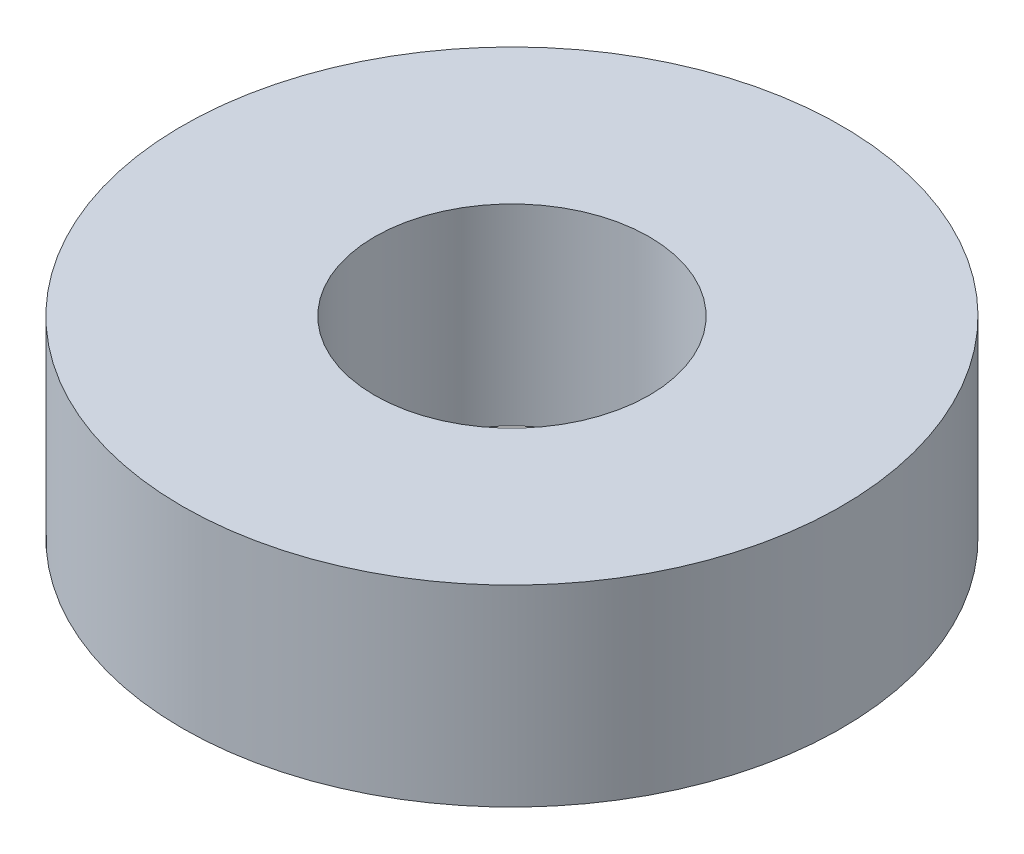
ISO-10303-21;
HEADER;
FILE_DESCRIPTION(('STEP AP214'),'2;1');
FILE_NAME('part.step','',(''),(''),'','','');
FILE_SCHEMA(('AUTOMOTIVE_DESIGN { 1 0 10303 214 1 1 1 1 }'));
ENDSEC;
DATA;
#1=APPLICATION_CONTEXT('core data for automotive mechanical design processes');
#2=APPLICATION_PROTOCOL_DEFINITION('international standard','automotive_design',2000,#1);
#3=PRODUCT_CONTEXT('',#1,'mechanical');
#4=PRODUCT('Part','Part','',(#3));
#5=PRODUCT_RELATED_PRODUCT_CATEGORY('part','',(#4));
#6=PRODUCT_DEFINITION_FORMATION('','',#4);
#7=PRODUCT_DEFINITION_CONTEXT('part definition',#1,'design');
#8=PRODUCT_DEFINITION('design','',#6,#7);
#9=PRODUCT_DEFINITION_SHAPE('','',#8);
#10=(LENGTH_UNIT() NAMED_UNIT(*) SI_UNIT(.MILLI.,.METRE.));
#11=(NAMED_UNIT(*) PLANE_ANGLE_UNIT() SI_UNIT($,.RADIAN.));
#12=(NAMED_UNIT(*) SI_UNIT($,.STERADIAN.) SOLID_ANGLE_UNIT());
#13=UNCERTAINTY_MEASURE_WITH_UNIT(LENGTH_MEASURE(1.E-05),#10,'distance_accuracy_value','');
#14=(GEOMETRIC_REPRESENTATION_CONTEXT(3) GLOBAL_UNCERTAINTY_ASSIGNED_CONTEXT((#13)) GLOBAL_UNIT_ASSIGNED_CONTEXT((#10,
#11,#12)) REPRESENTATION_CONTEXT('',''));
#15=CARTESIAN_POINT('',(0.,0.,0.));
#16=DIRECTION('',(0.,0.,1.));
#17=DIRECTION('',(1.,0.,0.));
#18=AXIS2_PLACEMENT_3D('',#15,#16,#17);
#19=CARTESIAN_POINT('',(0.,7.,0.));
#20=DIRECTION('',(0.,1.,0.));
#21=DIRECTION('',(0.,0.,1.));
#22=AXIS2_PLACEMENT_3D('',#19,#20,#21);
#23=PLANE('',#22);
#24=CARTESIAN_POINT('',(0.,7.,0.));
#25=DIRECTION('',(0.,1.,0.));
#26=DIRECTION('',(0.,0.,1.));
#27=AXIS2_PLACEMENT_3D('',#24,#25,#26);
#28=CIRCLE('',#27,12.);
#29=CARTESIAN_POINT('',(0.,7.,12.));
#30=VERTEX_POINT('',#29);
#31=EDGE_CURVE('E10',#30,#30,#28,.T.);
#32=ORIENTED_EDGE('',*,*,#31,.T.);
#33=EDGE_LOOP('',(#32));
#34=FACE_BOUND('',#33,.T.);
#35=CARTESIAN_POINT('',(0.,7.,0.));
#36=DIRECTION('',(0.,1.,0.));
#37=DIRECTION('',(0.,0.,1.));
#38=AXIS2_PLACEMENT_3D('',#35,#36,#37);
#39=CIRCLE('',#38,5.);
#40=CARTESIAN_POINT('',(0.,7.,5.));
#41=VERTEX_POINT('',#40);
#42=EDGE_CURVE('E45',#41,#41,#39,.T.);
#43=ORIENTED_EDGE('',*,*,#42,.F.);
#44=EDGE_LOOP('',(#43));
#45=FACE_BOUND('',#44,.T.);
#46=ADVANCED_FACE('F34',(#34,#45),#23,.T.);
#47=CARTESIAN_POINT('',(0.,0.,0.));
#48=DIRECTION('',(0.,1.,0.));
#49=DIRECTION('',(0.,0.,1.));
#50=AXIS2_PLACEMENT_3D('',#47,#48,#49);
#51=PLANE('',#50);
#52=CARTESIAN_POINT('',(0.,0.,0.));
#53=DIRECTION('',(0.,1.,0.));
#54=DIRECTION('',(0.,0.,1.));
#55=AXIS2_PLACEMENT_3D('',#52,#53,#54);
#56=CIRCLE('',#55,12.);
#57=CARTESIAN_POINT('',(0.,0.,12.));
#58=VERTEX_POINT('',#57);
#59=EDGE_CURVE('E38',#58,#58,#56,.T.);
#60=ORIENTED_EDGE('',*,*,#59,.F.);
#61=EDGE_LOOP('',(#60));
#62=FACE_BOUND('',#61,.T.);
#63=CARTESIAN_POINT('',(0.,0.,0.));
#64=DIRECTION('',(0.,1.,0.));
#65=DIRECTION('',(0.,0.,1.));
#66=AXIS2_PLACEMENT_3D('',#63,#64,#65);
#67=CIRCLE('',#66,5.);
#68=CARTESIAN_POINT('',(0.,0.,5.));
#69=VERTEX_POINT('',#68);
#70=EDGE_CURVE('E47',#69,#69,#67,.T.);
#71=ORIENTED_EDGE('',*,*,#70,.T.);
#72=EDGE_LOOP('',(#71));
#73=FACE_BOUND('',#72,.T.);
#74=ADVANCED_FACE('F57',(#62,#73),#51,.F.);
#75=CARTESIAN_POINT('',(0.,7.,0.));
#76=DIRECTION('',(0.,-1.,0.));
#77=DIRECTION('',(0.,0.,-1.));
#78=AXIS2_PLACEMENT_3D('',#75,#76,#77);
#79=CYLINDRICAL_SURFACE('',#78,12.);
#80=ORIENTED_EDGE('',*,*,#31,.F.);
#81=EDGE_LOOP('',(#80));
#82=FACE_BOUND('',#81,.T.);
#83=ORIENTED_EDGE('',*,*,#59,.T.);
#84=EDGE_LOOP('',(#83));
#85=FACE_BOUND('',#84,.T.);
#86=ADVANCED_FACE('F36',(#82,#85),#79,.T.);
#87=CARTESIAN_POINT('',(0.,7.,0.));
#88=DIRECTION('',(0.,-1.,0.));
#89=DIRECTION('',(0.,0.,-1.));
#90=AXIS2_PLACEMENT_3D('',#87,#88,#89);
#91=CYLINDRICAL_SURFACE('',#90,5.);
#92=ORIENTED_EDGE('',*,*,#42,.T.);
#93=EDGE_LOOP('',(#92));
#94=FACE_BOUND('',#93,.T.);
#95=ORIENTED_EDGE('',*,*,#70,.F.);
#96=EDGE_LOOP('',(#95));
#97=FACE_BOUND('',#96,.T.);
#98=ADVANCED_FACE('F53',(#94,#97),#91,.F.);
#99=CLOSED_SHELL('',(#46,#74,#86,#98));
#100=MANIFOLD_SOLID_BREP('B2',#99);
#101=ADVANCED_BREP_SHAPE_REPRESENTATION('',(#18,#100),#14);
#102=SHAPE_DEFINITION_REPRESENTATION(#9,#101);
ENDSEC;
END-ISO-10303-21;
